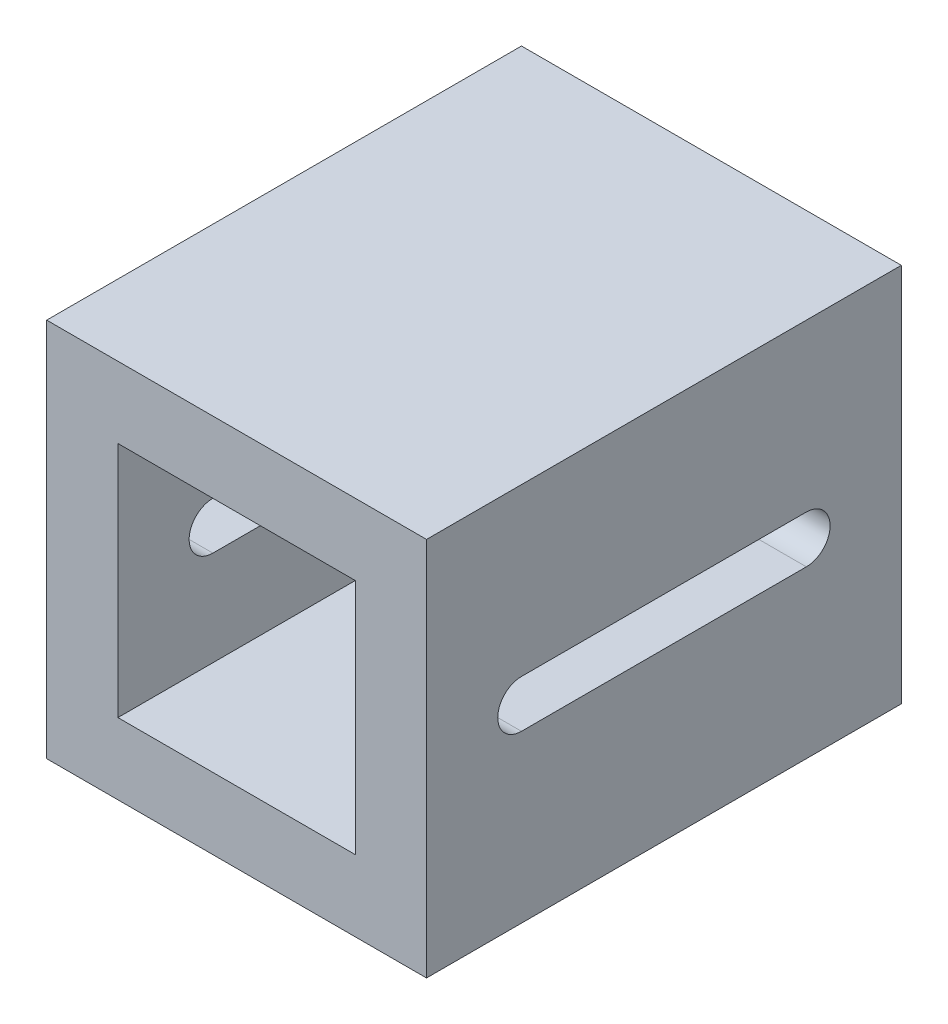
ISO-10303-21;
HEADER;
FILE_DESCRIPTION(('STEP AP214'),'2;1');
FILE_NAME('part.step','',(''),(''),'','','');
FILE_SCHEMA(('AUTOMOTIVE_DESIGN { 1 0 10303 214 1 1 1 1 }'));
ENDSEC;
DATA;
#1=APPLICATION_CONTEXT('core data for automotive mechanical design processes');
#2=APPLICATION_PROTOCOL_DEFINITION('international standard','automotive_design',2000,#1);
#3=PRODUCT_CONTEXT('',#1,'mechanical');
#4=PRODUCT('Part','Part','',(#3));
#5=PRODUCT_RELATED_PRODUCT_CATEGORY('part','',(#4));
#6=PRODUCT_DEFINITION_FORMATION('','',#4);
#7=PRODUCT_DEFINITION_CONTEXT('part definition',#1,'design');
#8=PRODUCT_DEFINITION('design','',#6,#7);
#9=PRODUCT_DEFINITION_SHAPE('','',#8);
#10=(LENGTH_UNIT() NAMED_UNIT(*) SI_UNIT(.MILLI.,.METRE.));
#11=(NAMED_UNIT(*) PLANE_ANGLE_UNIT() SI_UNIT($,.RADIAN.));
#12=(NAMED_UNIT(*) SI_UNIT($,.STERADIAN.) SOLID_ANGLE_UNIT());
#13=UNCERTAINTY_MEASURE_WITH_UNIT(LENGTH_MEASURE(1.E-05),#10,'distance_accuracy_value','');
#14=(GEOMETRIC_REPRESENTATION_CONTEXT(3) GLOBAL_UNCERTAINTY_ASSIGNED_CONTEXT((#13)) GLOBAL_UNIT_ASSIGNED_CONTEXT((#10,
#11,#12)) REPRESENTATION_CONTEXT('',''));
#15=CARTESIAN_POINT('',(0.,0.,0.));
#16=DIRECTION('',(0.,0.,1.));
#17=DIRECTION('',(1.,0.,0.));
#18=AXIS2_PLACEMENT_3D('',#15,#16,#17);
#19=CARTESIAN_POINT('',(0.,0.,20.));
#20=DIRECTION('',(0.,0.,-1.));
#21=DIRECTION('',(-1.,0.,0.));
#22=AXIS2_PLACEMENT_3D('',#19,#20,#21);
#23=PLANE('',#22);
#24=DIRECTION('',(0.,-1.,0.));
#25=VECTOR('',#24,1.);
#26=CARTESIAN_POINT('',(0.,0.,20.));
#27=LINE('',#26,#25);
#28=CARTESIAN_POINT('',(0.,16.,20.));
#29=VERTEX_POINT('',#28);
#30=CARTESIAN_POINT('',(0.,0.,20.));
#31=VERTEX_POINT('',#30);
#32=EDGE_CURVE('E281',#29,#31,#27,.T.);
#33=ORIENTED_EDGE('',*,*,#32,.T.);
#34=DIRECTION('',(1.,0.,0.));
#35=VECTOR('',#34,1.);
#36=CARTESIAN_POINT('',(0.,0.,20.));
#37=LINE('',#36,#35);
#38=CARTESIAN_POINT('',(16.,0.,20.));
#39=VERTEX_POINT('',#38);
#40=EDGE_CURVE('E285',#31,#39,#37,.T.);
#41=ORIENTED_EDGE('',*,*,#40,.T.);
#42=DIRECTION('',(0.,1.,0.));
#43=VECTOR('',#42,1.);
#44=CARTESIAN_POINT('',(16.,0.,20.));
#45=LINE('',#44,#43);
#46=CARTESIAN_POINT('',(16.,16.,20.));
#47=VERTEX_POINT('',#46);
#48=EDGE_CURVE('E289',#39,#47,#45,.T.);
#49=ORIENTED_EDGE('',*,*,#48,.T.);
#50=DIRECTION('',(-1.,0.,0.));
#51=VECTOR('',#50,1.);
#52=CARTESIAN_POINT('',(0.,16.,20.));
#53=LINE('',#52,#51);
#54=EDGE_CURVE('E292',#47,#29,#53,.T.);
#55=ORIENTED_EDGE('',*,*,#54,.T.);
#56=EDGE_LOOP('',(#33,#41,#49,#55));
#57=FACE_BOUND('',#56,.T.);
#58=DIRECTION('',(0.,-1.,0.));
#59=VECTOR('',#58,1.);
#60=CARTESIAN_POINT('',(3.,3.,20.));
#61=LINE('',#60,#59);
#62=CARTESIAN_POINT('',(3.,13.,20.));
#63=VERTEX_POINT('',#62);
#64=CARTESIAN_POINT('',(3.,3.,20.));
#65=VERTEX_POINT('',#64);
#66=EDGE_CURVE('E238',#63,#65,#61,.T.);
#67=ORIENTED_EDGE('',*,*,#66,.F.);
#68=DIRECTION('',(-1.,0.,0.));
#69=VECTOR('',#68,1.);
#70=CARTESIAN_POINT('',(3.,13.,20.));
#71=LINE('',#70,#69);
#72=CARTESIAN_POINT('',(13.,13.,20.));
#73=VERTEX_POINT('',#72);
#74=EDGE_CURVE('E249',#73,#63,#71,.T.);
#75=ORIENTED_EDGE('',*,*,#74,.F.);
#76=DIRECTION('',(0.,1.,0.));
#77=VECTOR('',#76,1.);
#78=CARTESIAN_POINT('',(13.,3.,20.));
#79=LINE('',#78,#77);
#80=CARTESIAN_POINT('',(13.,3.,20.));
#81=VERTEX_POINT('',#80);
#82=EDGE_CURVE('E245',#81,#73,#79,.T.);
#83=ORIENTED_EDGE('',*,*,#82,.F.);
#84=DIRECTION('',(1.,0.,0.));
#85=VECTOR('',#84,1.);
#86=CARTESIAN_POINT('',(3.,3.,20.));
#87=LINE('',#86,#85);
#88=EDGE_CURVE('E241',#65,#81,#87,.T.);
#89=ORIENTED_EDGE('',*,*,#88,.F.);
#90=EDGE_LOOP('',(#67,#75,#83,#89));
#91=FACE_BOUND('',#90,.T.);
#92=ADVANCED_FACE('F54',(#57,#91),#23,.F.);
#93=CARTESIAN_POINT('',(0.,0.,0.));
#94=DIRECTION('',(0.,0.,-1.));
#95=DIRECTION('',(-1.,0.,0.));
#96=AXIS2_PLACEMENT_3D('',#93,#94,#95);
#97=PLANE('',#96);
#98=DIRECTION('',(0.,-1.,0.));
#99=VECTOR('',#98,1.);
#100=CARTESIAN_POINT('',(0.,0.,0.));
#101=LINE('',#100,#99);
#102=CARTESIAN_POINT('',(0.,16.,0.));
#103=VERTEX_POINT('',#102);
#104=CARTESIAN_POINT('',(0.,0.,0.));
#105=VERTEX_POINT('',#104);
#106=EDGE_CURVE('E280',#103,#105,#101,.T.);
#107=ORIENTED_EDGE('',*,*,#106,.F.);
#108=DIRECTION('',(-1.,0.,0.));
#109=VECTOR('',#108,1.);
#110=CARTESIAN_POINT('',(0.,16.,0.));
#111=LINE('',#110,#109);
#112=CARTESIAN_POINT('',(16.,16.,0.));
#113=VERTEX_POINT('',#112);
#114=EDGE_CURVE('E286',#113,#103,#111,.T.);
#115=ORIENTED_EDGE('',*,*,#114,.F.);
#116=DIRECTION('',(0.,1.,0.));
#117=VECTOR('',#116,1.);
#118=CARTESIAN_POINT('',(16.,0.,0.));
#119=LINE('',#118,#117);
#120=CARTESIAN_POINT('',(16.,0.,0.));
#121=VERTEX_POINT('',#120);
#122=EDGE_CURVE('E302',#121,#113,#119,.T.);
#123=ORIENTED_EDGE('',*,*,#122,.F.);
#124=DIRECTION('',(1.,0.,0.));
#125=VECTOR('',#124,1.);
#126=CARTESIAN_POINT('',(0.,0.,0.));
#127=LINE('',#126,#125);
#128=EDGE_CURVE('E299',#105,#121,#127,.T.);
#129=ORIENTED_EDGE('',*,*,#128,.F.);
#130=EDGE_LOOP('',(#107,#115,#123,#129));
#131=FACE_BOUND('',#130,.T.);
#132=DIRECTION('',(-1.,0.,0.));
#133=VECTOR('',#132,1.);
#134=CARTESIAN_POINT('',(3.,13.,0.));
#135=LINE('',#134,#133);
#136=CARTESIAN_POINT('',(13.,13.,0.));
#137=VERTEX_POINT('',#136);
#138=CARTESIAN_POINT('',(3.,13.,0.));
#139=VERTEX_POINT('',#138);
#140=EDGE_CURVE('E242',#137,#139,#135,.T.);
#141=ORIENTED_EDGE('',*,*,#140,.T.);
#142=DIRECTION('',(0.,-1.,0.));
#143=VECTOR('',#142,1.);
#144=CARTESIAN_POINT('',(3.,3.,0.));
#145=LINE('',#144,#143);
#146=CARTESIAN_POINT('',(3.,3.,0.));
#147=VERTEX_POINT('',#146);
#148=EDGE_CURVE('E237',#139,#147,#145,.T.);
#149=ORIENTED_EDGE('',*,*,#148,.T.);
#150=DIRECTION('',(1.,0.,0.));
#151=VECTOR('',#150,1.);
#152=CARTESIAN_POINT('',(3.,3.,0.));
#153=LINE('',#152,#151);
#154=CARTESIAN_POINT('',(13.,3.,0.));
#155=VERTEX_POINT('',#154);
#156=EDGE_CURVE('E256',#147,#155,#153,.T.);
#157=ORIENTED_EDGE('',*,*,#156,.T.);
#158=DIRECTION('',(0.,1.,0.));
#159=VECTOR('',#158,1.);
#160=CARTESIAN_POINT('',(13.,3.,0.));
#161=LINE('',#160,#159);
#162=EDGE_CURVE('E260',#155,#137,#161,.T.);
#163=ORIENTED_EDGE('',*,*,#162,.T.);
#164=EDGE_LOOP('',(#141,#149,#157,#163));
#165=FACE_BOUND('',#164,.T.);
#166=ADVANCED_FACE('F367',(#131,#165),#97,.T.);
#167=CARTESIAN_POINT('',(0.,0.,20.));
#168=DIRECTION('',(1.,0.,0.));
#169=DIRECTION('',(0.,0.,-1.));
#170=AXIS2_PLACEMENT_3D('',#167,#168,#169);
#171=PLANE('',#170);
#172=DIRECTION('',(0.,0.,-1.));
#173=VECTOR('',#172,1.);
#174=CARTESIAN_POINT('',(0.,9.,0.));
#175=LINE('',#174,#173);
#176=CARTESIAN_POINT('',(0.,9.,16.));
#177=VERTEX_POINT('',#176);
#178=CARTESIAN_POINT('',(0.,9.,4.));
#179=VERTEX_POINT('',#178);
#180=EDGE_CURVE('E170',#177,#179,#175,.T.);
#181=ORIENTED_EDGE('',*,*,#180,.F.);
#182=CARTESIAN_POINT('',(0.,8.,16.));
#183=DIRECTION('',(1.,0.,0.));
#184=DIRECTION('',(0.,0.,-1.));
#185=AXIS2_PLACEMENT_3D('',#182,#183,#184);
#186=CIRCLE('',#185,1.);
#187=CARTESIAN_POINT('',(0.,7.,16.));
#188=VERTEX_POINT('',#187);
#189=EDGE_CURVE('E180',#177,#188,#186,.T.);
#190=ORIENTED_EDGE('',*,*,#189,.T.);
#191=DIRECTION('',(0.,0.,1.));
#192=VECTOR('',#191,1.);
#193=CARTESIAN_POINT('',(0.,7.,0.));
#194=LINE('',#193,#192);
#195=CARTESIAN_POINT('',(0.,7.,4.));
#196=VERTEX_POINT('',#195);
#197=EDGE_CURVE('E192',#196,#188,#194,.T.);
#198=ORIENTED_EDGE('',*,*,#197,.F.);
#199=CARTESIAN_POINT('',(0.,8.,4.));
#200=DIRECTION('',(1.,0.,0.));
#201=DIRECTION('',(0.,0.,-1.));
#202=AXIS2_PLACEMENT_3D('',#199,#200,#201);
#203=CIRCLE('',#202,1.);
#204=EDGE_CURVE('E70',#196,#179,#203,.T.);
#205=ORIENTED_EDGE('',*,*,#204,.T.);
#206=EDGE_LOOP('',(#181,#190,#198,#205));
#207=FACE_BOUND('',#206,.T.);
#208=ORIENTED_EDGE('',*,*,#106,.T.);
#209=DIRECTION('',(0.,0.,-1.));
#210=VECTOR('',#209,1.);
#211=CARTESIAN_POINT('',(0.,0.,20.));
#212=LINE('',#211,#210);
#213=EDGE_CURVE('E318',#31,#105,#212,.T.);
#214=ORIENTED_EDGE('',*,*,#213,.F.);
#215=ORIENTED_EDGE('',*,*,#32,.F.);
#216=DIRECTION('',(0.,0.,-1.));
#217=VECTOR('',#216,1.);
#218=CARTESIAN_POINT('',(0.,16.,20.));
#219=LINE('',#218,#217);
#220=EDGE_CURVE('E295',#29,#103,#219,.T.);
#221=ORIENTED_EDGE('',*,*,#220,.T.);
#222=EDGE_LOOP('',(#208,#214,#215,#221));
#223=FACE_BOUND('',#222,.T.);
#224=ADVANCED_FACE('F56',(#207,#223),#171,.F.);
#225=CARTESIAN_POINT('',(0.,0.,20.));
#226=DIRECTION('',(0.,1.,0.));
#227=DIRECTION('',(0.,0.,1.));
#228=AXIS2_PLACEMENT_3D('',#225,#226,#227);
#229=PLANE('',#228);
#230=ORIENTED_EDGE('',*,*,#128,.T.);
#231=DIRECTION('',(0.,0.,-1.));
#232=VECTOR('',#231,1.);
#233=CARTESIAN_POINT('',(16.,0.,20.));
#234=LINE('',#233,#232);
#235=EDGE_CURVE('E314',#39,#121,#234,.T.);
#236=ORIENTED_EDGE('',*,*,#235,.F.);
#237=ORIENTED_EDGE('',*,*,#40,.F.);
#238=ORIENTED_EDGE('',*,*,#213,.T.);
#239=EDGE_LOOP('',(#230,#236,#237,#238));
#240=FACE_BOUND('',#239,.T.);
#241=ADVANCED_FACE('F355',(#240),#229,.F.);
#242=CARTESIAN_POINT('',(16.,0.,20.));
#243=DIRECTION('',(-1.,0.,0.));
#244=DIRECTION('',(0.,0.,1.));
#245=AXIS2_PLACEMENT_3D('',#242,#243,#244);
#246=PLANE('',#245);
#247=DIRECTION('',(0.,0.,1.));
#248=VECTOR('',#247,1.);
#249=CARTESIAN_POINT('',(16.,7.,0.));
#250=LINE('',#249,#248);
#251=CARTESIAN_POINT('',(16.,7.,4.));
#252=VERTEX_POINT('',#251);
#253=CARTESIAN_POINT('',(16.,7.,16.));
#254=VERTEX_POINT('',#253);
#255=EDGE_CURVE('E201',#252,#254,#250,.T.);
#256=ORIENTED_EDGE('',*,*,#255,.T.);
#257=CARTESIAN_POINT('',(16.,8.,16.));
#258=DIRECTION('',(1.,0.,0.));
#259=DIRECTION('',(0.,0.,-1.));
#260=AXIS2_PLACEMENT_3D('',#257,#258,#259);
#261=CIRCLE('',#260,1.);
#262=CARTESIAN_POINT('',(16.,9.,16.));
#263=VERTEX_POINT('',#262);
#264=EDGE_CURVE('E78',#263,#254,#261,.T.);
#265=ORIENTED_EDGE('',*,*,#264,.F.);
#266=DIRECTION('',(0.,0.,-1.));
#267=VECTOR('',#266,1.);
#268=CARTESIAN_POINT('',(16.,9.,0.));
#269=LINE('',#268,#267);
#270=CARTESIAN_POINT('',(16.,9.,4.));
#271=VERTEX_POINT('',#270);
#272=EDGE_CURVE('E209',#263,#271,#269,.T.);
#273=ORIENTED_EDGE('',*,*,#272,.T.);
#274=CARTESIAN_POINT('',(16.,8.,4.));
#275=DIRECTION('',(1.,0.,0.));
#276=DIRECTION('',(0.,0.,-1.));
#277=AXIS2_PLACEMENT_3D('',#274,#275,#276);
#278=CIRCLE('',#277,1.);
#279=EDGE_CURVE('E205',#252,#271,#278,.T.);
#280=ORIENTED_EDGE('',*,*,#279,.F.);
#281=EDGE_LOOP('',(#256,#265,#273,#280));
#282=FACE_BOUND('',#281,.T.);
#283=ORIENTED_EDGE('',*,*,#122,.T.);
#284=DIRECTION('',(0.,0.,-1.));
#285=VECTOR('',#284,1.);
#286=CARTESIAN_POINT('',(16.,16.,20.));
#287=LINE('',#286,#285);
#288=EDGE_CURVE('E310',#47,#113,#287,.T.);
#289=ORIENTED_EDGE('',*,*,#288,.F.);
#290=ORIENTED_EDGE('',*,*,#48,.F.);
#291=ORIENTED_EDGE('',*,*,#235,.T.);
#292=EDGE_LOOP('',(#283,#289,#290,#291));
#293=FACE_BOUND('',#292,.T.);
#294=ADVANCED_FACE('F351',(#282,#293),#246,.F.);
#295=CARTESIAN_POINT('',(0.,16.,20.));
#296=DIRECTION('',(0.,-1.,0.));
#297=DIRECTION('',(0.,0.,-1.));
#298=AXIS2_PLACEMENT_3D('',#295,#296,#297);
#299=PLANE('',#298);
#300=ORIENTED_EDGE('',*,*,#114,.T.);
#301=ORIENTED_EDGE('',*,*,#220,.F.);
#302=ORIENTED_EDGE('',*,*,#54,.F.);
#303=ORIENTED_EDGE('',*,*,#288,.T.);
#304=EDGE_LOOP('',(#300,#301,#302,#303));
#305=FACE_BOUND('',#304,.T.);
#306=ADVANCED_FACE('F354',(#305),#299,.F.);
#307=CARTESIAN_POINT('',(3.,3.,20.));
#308=DIRECTION('',(1.,0.,0.));
#309=DIRECTION('',(0.,0.,-1.));
#310=AXIS2_PLACEMENT_3D('',#307,#308,#309);
#311=PLANE('',#310);
#312=CARTESIAN_POINT('',(3.,8.,16.));
#313=DIRECTION('',(1.,0.,0.));
#314=DIRECTION('',(0.,0.,-1.));
#315=AXIS2_PLACEMENT_3D('',#312,#313,#314);
#316=CIRCLE('',#315,1.);
#317=CARTESIAN_POINT('',(3.,9.,16.));
#318=VERTEX_POINT('',#317);
#319=CARTESIAN_POINT('',(3.,7.,16.));
#320=VERTEX_POINT('',#319);
#321=EDGE_CURVE('E233',#318,#320,#316,.T.);
#322=ORIENTED_EDGE('',*,*,#321,.F.);
#323=DIRECTION('',(0.,0.,-1.));
#324=VECTOR('',#323,1.);
#325=CARTESIAN_POINT('',(3.,9.,20.));
#326=LINE('',#325,#324);
#327=CARTESIAN_POINT('',(3.,9.,4.));
#328=VERTEX_POINT('',#327);
#329=EDGE_CURVE('E230',#318,#328,#326,.T.);
#330=ORIENTED_EDGE('',*,*,#329,.T.);
#331=CARTESIAN_POINT('',(3.,8.,4.));
#332=DIRECTION('',(1.,0.,0.));
#333=DIRECTION('',(0.,0.,-1.));
#334=AXIS2_PLACEMENT_3D('',#331,#332,#333);
#335=CIRCLE('',#334,1.);
#336=CARTESIAN_POINT('',(3.,7.,4.));
#337=VERTEX_POINT('',#336);
#338=EDGE_CURVE('E184',#337,#328,#335,.T.);
#339=ORIENTED_EDGE('',*,*,#338,.F.);
#340=DIRECTION('',(0.,0.,1.));
#341=VECTOR('',#340,1.);
#342=CARTESIAN_POINT('',(3.,7.,20.));
#343=LINE('',#342,#341);
#344=EDGE_CURVE('E218',#337,#320,#343,.T.);
#345=ORIENTED_EDGE('',*,*,#344,.T.);
#346=EDGE_LOOP('',(#322,#330,#339,#345));
#347=FACE_BOUND('',#346,.T.);
#348=ORIENTED_EDGE('',*,*,#148,.F.);
#349=DIRECTION('',(0.,0.,-1.));
#350=VECTOR('',#349,1.);
#351=CARTESIAN_POINT('',(3.,13.,20.));
#352=LINE('',#351,#350);
#353=EDGE_CURVE('E252',#63,#139,#352,.T.);
#354=ORIENTED_EDGE('',*,*,#353,.F.);
#355=ORIENTED_EDGE('',*,*,#66,.T.);
#356=DIRECTION('',(0.,0.,-1.));
#357=VECTOR('',#356,1.);
#358=CARTESIAN_POINT('',(3.,3.,20.));
#359=LINE('',#358,#357);
#360=EDGE_CURVE('E276',#65,#147,#359,.T.);
#361=ORIENTED_EDGE('',*,*,#360,.T.);
#362=EDGE_LOOP('',(#348,#354,#355,#361));
#363=FACE_BOUND('',#362,.T.);
#364=ADVANCED_FACE('F385',(#347,#363),#311,.T.);
#365=CARTESIAN_POINT('',(3.,3.,20.));
#366=DIRECTION('',(0.,1.,0.));
#367=DIRECTION('',(0.,0.,1.));
#368=AXIS2_PLACEMENT_3D('',#365,#366,#367);
#369=PLANE('',#368);
#370=ORIENTED_EDGE('',*,*,#156,.F.);
#371=ORIENTED_EDGE('',*,*,#360,.F.);
#372=ORIENTED_EDGE('',*,*,#88,.T.);
#373=DIRECTION('',(0.,0.,-1.));
#374=VECTOR('',#373,1.);
#375=CARTESIAN_POINT('',(13.,3.,20.));
#376=LINE('',#375,#374);
#377=EDGE_CURVE('E273',#81,#155,#376,.T.);
#378=ORIENTED_EDGE('',*,*,#377,.T.);
#379=EDGE_LOOP('',(#370,#371,#372,#378));
#380=FACE_BOUND('',#379,.T.);
#381=ADVANCED_FACE('F392',(#380),#369,.T.);
#382=CARTESIAN_POINT('',(13.,3.,20.));
#383=DIRECTION('',(-1.,0.,0.));
#384=DIRECTION('',(0.,-1.,0.));
#385=AXIS2_PLACEMENT_3D('',#382,#383,#384);
#386=PLANE('',#385);
#387=CARTESIAN_POINT('',(13.,8.,16.));
#388=DIRECTION('',(-1.,0.,0.));
#389=DIRECTION('',(0.,-1.,0.));
#390=AXIS2_PLACEMENT_3D('',#387,#388,#389);
#391=CIRCLE('',#390,1.);
#392=CARTESIAN_POINT('',(13.,7.,16.));
#393=VERTEX_POINT('',#392);
#394=CARTESIAN_POINT('',(13.,9.,16.));
#395=VERTEX_POINT('',#394);
#396=EDGE_CURVE('E12',#393,#395,#391,.T.);
#397=ORIENTED_EDGE('',*,*,#396,.F.);
#398=DIRECTION('',(0.,0.,-1.));
#399=VECTOR('',#398,1.);
#400=CARTESIAN_POINT('',(13.,7.,20.));
#401=LINE('',#400,#399);
#402=CARTESIAN_POINT('',(13.,7.,4.));
#403=VERTEX_POINT('',#402);
#404=EDGE_CURVE('E322',#393,#403,#401,.T.);
#405=ORIENTED_EDGE('',*,*,#404,.T.);
#406=CARTESIAN_POINT('',(13.,8.,4.));
#407=DIRECTION('',(-1.,0.,0.));
#408=DIRECTION('',(0.,-1.,0.));
#409=AXIS2_PLACEMENT_3D('',#406,#407,#408);
#410=CIRCLE('',#409,1.);
#411=CARTESIAN_POINT('',(13.,9.,4.));
#412=VERTEX_POINT('',#411);
#413=EDGE_CURVE('E326',#412,#403,#410,.T.);
#414=ORIENTED_EDGE('',*,*,#413,.F.);
#415=DIRECTION('',(0.,0.,1.));
#416=VECTOR('',#415,1.);
#417=CARTESIAN_POINT('',(13.,9.,20.));
#418=LINE('',#417,#416);
#419=EDGE_CURVE('E63',#412,#395,#418,.T.);
#420=ORIENTED_EDGE('',*,*,#419,.T.);
#421=EDGE_LOOP('',(#397,#405,#414,#420));
#422=FACE_BOUND('',#421,.T.);
#423=ORIENTED_EDGE('',*,*,#162,.F.);
#424=ORIENTED_EDGE('',*,*,#377,.F.);
#425=ORIENTED_EDGE('',*,*,#82,.T.);
#426=DIRECTION('',(0.,0.,-1.));
#427=VECTOR('',#426,1.);
#428=CARTESIAN_POINT('',(13.,13.,20.));
#429=LINE('',#428,#427);
#430=EDGE_CURVE('E270',#73,#137,#429,.T.);
#431=ORIENTED_EDGE('',*,*,#430,.T.);
#432=EDGE_LOOP('',(#423,#424,#425,#431));
#433=FACE_BOUND('',#432,.T.);
#434=ADVANCED_FACE('F334',(#422,#433),#386,.T.);
#435=CARTESIAN_POINT('',(3.,13.,20.));
#436=DIRECTION('',(0.,-1.,0.));
#437=DIRECTION('',(0.,0.,-1.));
#438=AXIS2_PLACEMENT_3D('',#435,#436,#437);
#439=PLANE('',#438);
#440=ORIENTED_EDGE('',*,*,#140,.F.);
#441=ORIENTED_EDGE('',*,*,#430,.F.);
#442=ORIENTED_EDGE('',*,*,#74,.T.);
#443=ORIENTED_EDGE('',*,*,#353,.T.);
#444=EDGE_LOOP('',(#440,#441,#442,#443));
#445=FACE_BOUND('',#444,.T.);
#446=ADVANCED_FACE('F405',(#445),#439,.T.);
#447=CARTESIAN_POINT('',(0.,7.,0.));
#448=DIRECTION('',(0.,1.,0.));
#449=DIRECTION('',(0.,0.,1.));
#450=AXIS2_PLACEMENT_3D('',#447,#448,#449);
#451=PLANE('',#450);
#452=DIRECTION('',(1.,0.,0.));
#453=VECTOR('',#452,1.);
#454=CARTESIAN_POINT('',(0.,7.,16.));
#455=LINE('',#454,#453);
#456=EDGE_CURVE('E219',#393,#254,#455,.T.);
#457=ORIENTED_EDGE('',*,*,#456,.T.);
#458=ORIENTED_EDGE('',*,*,#255,.F.);
#459=DIRECTION('',(1.,0.,0.));
#460=VECTOR('',#459,1.);
#461=CARTESIAN_POINT('',(0.,7.,4.));
#462=LINE('',#461,#460);
#463=EDGE_CURVE('E200',#403,#252,#462,.T.);
#464=ORIENTED_EDGE('',*,*,#463,.F.);
#465=ORIENTED_EDGE('',*,*,#404,.F.);
#466=EDGE_LOOP('',(#457,#458,#464,#465));
#467=FACE_BOUND('',#466,.T.);
#468=ADVANCED_FACE('F349',(#467),#451,.T.);
#469=CARTESIAN_POINT('',(0.,8.,4.));
#470=DIRECTION('',(1.,0.,0.));
#471=DIRECTION('',(0.,0.,-1.));
#472=AXIS2_PLACEMENT_3D('',#469,#470,#471);
#473=CYLINDRICAL_SURFACE('',#472,1.);
#474=ORIENTED_EDGE('',*,*,#413,.T.);
#475=ORIENTED_EDGE('',*,*,#463,.T.);
#476=ORIENTED_EDGE('',*,*,#279,.T.);
#477=DIRECTION('',(1.,0.,0.));
#478=VECTOR('',#477,1.);
#479=CARTESIAN_POINT('',(0.,9.,4.));
#480=LINE('',#479,#478);
#481=EDGE_CURVE('E187',#412,#271,#480,.T.);
#482=ORIENTED_EDGE('',*,*,#481,.F.);
#483=EDGE_LOOP('',(#474,#475,#476,#482));
#484=FACE_BOUND('',#483,.T.);
#485=ADVANCED_FACE('F342',(#484),#473,.F.);
#486=CARTESIAN_POINT('',(0.,9.,0.));
#487=DIRECTION('',(0.,-1.,0.));
#488=DIRECTION('',(0.,0.,-1.));
#489=AXIS2_PLACEMENT_3D('',#486,#487,#488);
#490=PLANE('',#489);
#491=ORIENTED_EDGE('',*,*,#481,.T.);
#492=ORIENTED_EDGE('',*,*,#272,.F.);
#493=DIRECTION('',(1.,0.,0.));
#494=VECTOR('',#493,1.);
#495=CARTESIAN_POINT('',(0.,9.,16.));
#496=LINE('',#495,#494);
#497=EDGE_CURVE('E186',#395,#263,#496,.T.);
#498=ORIENTED_EDGE('',*,*,#497,.F.);
#499=ORIENTED_EDGE('',*,*,#419,.F.);
#500=EDGE_LOOP('',(#491,#492,#498,#499));
#501=FACE_BOUND('',#500,.T.);
#502=ADVANCED_FACE('F339',(#501),#490,.T.);
#503=CARTESIAN_POINT('',(0.,8.,16.));
#504=DIRECTION('',(1.,0.,0.));
#505=DIRECTION('',(0.,0.,-1.));
#506=AXIS2_PLACEMENT_3D('',#503,#504,#505);
#507=CYLINDRICAL_SURFACE('',#506,1.);
#508=ORIENTED_EDGE('',*,*,#396,.T.);
#509=ORIENTED_EDGE('',*,*,#497,.T.);
#510=ORIENTED_EDGE('',*,*,#264,.T.);
#511=ORIENTED_EDGE('',*,*,#456,.F.);
#512=EDGE_LOOP('',(#508,#509,#510,#511));
#513=FACE_BOUND('',#512,.T.);
#514=ADVANCED_FACE('F425',(#513),#507,.F.);
#515=ORIENTED_EDGE('',*,*,#321,.T.);
#516=EDGE_CURVE('E215',#188,#320,#455,.T.);
#517=ORIENTED_EDGE('',*,*,#516,.F.);
#518=ORIENTED_EDGE('',*,*,#189,.F.);
#519=EDGE_CURVE('E175',#177,#318,#496,.T.);
#520=ORIENTED_EDGE('',*,*,#519,.T.);
#521=EDGE_LOOP('',(#515,#517,#518,#520));
#522=FACE_BOUND('',#521,.T.);
#523=ADVANCED_FACE('F427',(#522),#507,.F.);
#524=ORIENTED_EDGE('',*,*,#519,.F.);
#525=ORIENTED_EDGE('',*,*,#180,.T.);
#526=EDGE_CURVE('E172',#179,#328,#480,.T.);
#527=ORIENTED_EDGE('',*,*,#526,.T.);
#528=ORIENTED_EDGE('',*,*,#329,.F.);
#529=EDGE_LOOP('',(#524,#525,#527,#528));
#530=FACE_BOUND('',#529,.T.);
#531=ADVANCED_FACE('F171',(#530),#490,.T.);
#532=ORIENTED_EDGE('',*,*,#338,.T.);
#533=ORIENTED_EDGE('',*,*,#526,.F.);
#534=ORIENTED_EDGE('',*,*,#204,.F.);
#535=EDGE_CURVE('E222',#196,#337,#462,.T.);
#536=ORIENTED_EDGE('',*,*,#535,.T.);
#537=EDGE_LOOP('',(#532,#533,#534,#536));
#538=FACE_BOUND('',#537,.T.);
#539=ADVANCED_FACE('F182',(#538),#473,.F.);
#540=ORIENTED_EDGE('',*,*,#535,.F.);
#541=ORIENTED_EDGE('',*,*,#197,.T.);
#542=ORIENTED_EDGE('',*,*,#516,.T.);
#543=ORIENTED_EDGE('',*,*,#344,.F.);
#544=EDGE_LOOP('',(#540,#541,#542,#543));
#545=FACE_BOUND('',#544,.T.);
#546=ADVANCED_FACE('F420',(#545),#451,.T.);
#547=CLOSED_SHELL('',(#92,#166,#224,#241,#294,#306,#364,#381,#434,#446,#468,#485,#502,#514,#523,
#531,#539,#546));
#548=MANIFOLD_SOLID_BREP('B2',#547);
#549=ADVANCED_BREP_SHAPE_REPRESENTATION('',(#18,#548),#14);
#550=SHAPE_DEFINITION_REPRESENTATION(#9,#549);
ENDSEC;
END-ISO-10303-21;
